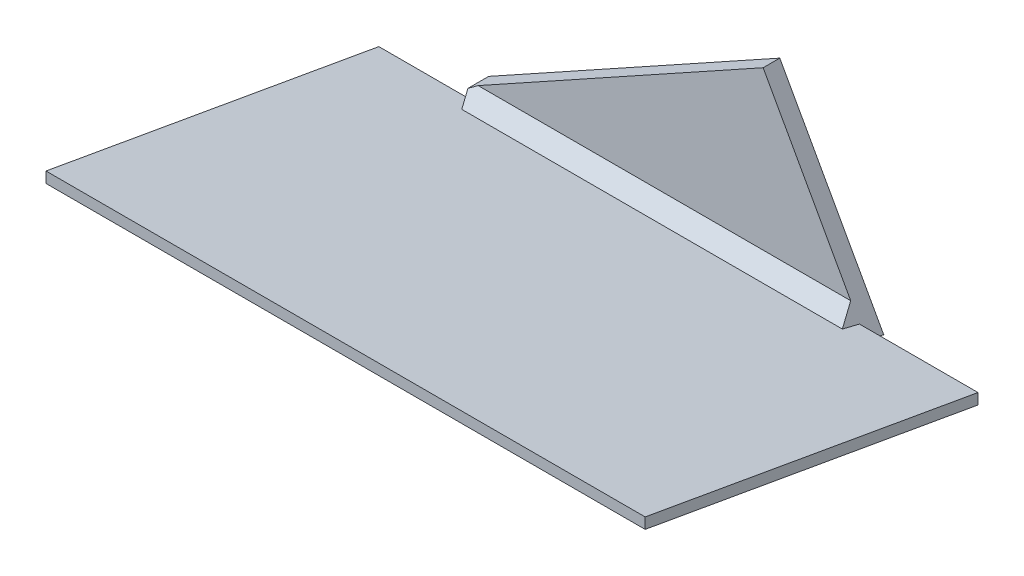
ISO-10303-21;
HEADER;
FILE_DESCRIPTION(('STEP AP214'),'2;1');
FILE_NAME('part.step','',(''),(''),'','','');
FILE_SCHEMA(('AUTOMOTIVE_DESIGN { 1 0 10303 214 1 1 1 1 }'));
ENDSEC;
DATA;
#1=APPLICATION_CONTEXT('core data for automotive mechanical design processes');
#2=APPLICATION_PROTOCOL_DEFINITION('international standard','automotive_design',2000,#1);
#3=PRODUCT_CONTEXT('',#1,'mechanical');
#4=PRODUCT('Part','Part','',(#3));
#5=PRODUCT_RELATED_PRODUCT_CATEGORY('part','',(#4));
#6=PRODUCT_DEFINITION_FORMATION('','',#4);
#7=PRODUCT_DEFINITION_CONTEXT('part definition',#1,'design');
#8=PRODUCT_DEFINITION('design','',#6,#7);
#9=PRODUCT_DEFINITION_SHAPE('','',#8);
#10=(LENGTH_UNIT() NAMED_UNIT(*) SI_UNIT(.MILLI.,.METRE.));
#11=(NAMED_UNIT(*) PLANE_ANGLE_UNIT() SI_UNIT($,.RADIAN.));
#12=(NAMED_UNIT(*) SI_UNIT($,.STERADIAN.) SOLID_ANGLE_UNIT());
#13=UNCERTAINTY_MEASURE_WITH_UNIT(LENGTH_MEASURE(1.E-05),#10,'distance_accuracy_value','');
#14=(GEOMETRIC_REPRESENTATION_CONTEXT(3) GLOBAL_UNCERTAINTY_ASSIGNED_CONTEXT((#13)) GLOBAL_UNIT_ASSIGNED_CONTEXT((#10,
#11,#12)) REPRESENTATION_CONTEXT('',''));
#15=CARTESIAN_POINT('',(0.,0.,0.));
#16=DIRECTION('',(0.,0.,1.));
#17=DIRECTION('',(1.,0.,0.));
#18=AXIS2_PLACEMENT_3D('',#15,#16,#17);
#19=CARTESIAN_POINT('',(-57.15,3.175,-31.75));
#20=DIRECTION('',(0.,0.,1.));
#21=DIRECTION('',(1.,0.,0.));
#22=AXIS2_PLACEMENT_3D('',#19,#20,#21);
#23=PLANE('',#22);
#24=DIRECTION('',(0.,-1.,0.));
#25=VECTOR('',#24,1.);
#26=CARTESIAN_POINT('',(57.15,3.175,-31.75));
#27=LINE('',#26,#25);
#28=CARTESIAN_POINT('',(57.15,3.175,-31.75));
#29=VERTEX_POINT('',#28);
#30=CARTESIAN_POINT('',(57.15,1.11165312464817,-31.75));
#31=VERTEX_POINT('',#30);
#32=EDGE_CURVE('E154',#29,#31,#27,.T.);
#33=ORIENTED_EDGE('',*,*,#32,.T.);
#34=DIRECTION('',(-1.,0.,0.));
#35=VECTOR('',#34,1.);
#36=CARTESIAN_POINT('',(-57.15,1.11165312464816,-31.75));
#37=LINE('',#36,#35);
#38=CARTESIAN_POINT('',(35.6852922659097,1.11165312464816,-31.75));
#39=VERTEX_POINT('',#38);
#40=EDGE_CURVE('E202',#31,#39,#37,.T.);
#41=ORIENTED_EDGE('',*,*,#40,.T.);
#42=DIRECTION('',(0.484809620246338,-0.874619707139395,0.));
#43=VECTOR('',#42,1.);
#44=CARTESIAN_POINT('',(16.1583186598094,36.3392460259776,-31.75));
#45=LINE('',#44,#43);
#46=CARTESIAN_POINT('',(34.5415604166154,3.17499999999999,-31.75));
#47=VERTEX_POINT('',#46);
#48=EDGE_CURVE('E165',#47,#39,#45,.T.);
#49=ORIENTED_EDGE('',*,*,#48,.F.);
#50=DIRECTION('',(-1.,0.,0.));
#51=VECTOR('',#50,1.);
#52=CARTESIAN_POINT('',(-57.15,3.175,-31.75));
#53=LINE('',#52,#51);
#54=EDGE_CURVE('E156',#29,#47,#53,.T.);
#55=ORIENTED_EDGE('',*,*,#54,.F.);
#56=EDGE_LOOP('',(#33,#41,#49,#55));
#57=FACE_BOUND('',#56,.T.);
#58=ADVANCED_FACE('F45',(#57),#23,.F.);
#59=CARTESIAN_POINT('',(57.15,3.175,-31.75));
#60=DIRECTION('',(-1.,0.,0.));
#61=DIRECTION('',(0.,0.,1.));
#62=AXIS2_PLACEMENT_3D('',#59,#60,#61);
#63=PLANE('',#62);
#64=DIRECTION('',(0.,-1.,0.));
#65=VECTOR('',#64,1.);
#66=CARTESIAN_POINT('',(57.15,3.175,31.75));
#67=LINE('',#66,#65);
#68=CARTESIAN_POINT('',(57.15,14.3717632749875,31.75));
#69=VERTEX_POINT('',#68);
#70=CARTESIAN_POINT('',(57.15,12.3084163996357,31.75));
#71=VERTEX_POINT('',#70);
#72=EDGE_CURVE('E152',#69,#71,#67,.T.);
#73=ORIENTED_EDGE('',*,*,#72,.T.);
#74=DIRECTION('',(0.,0.17364817766693,0.984807753012208));
#75=VECTOR('',#74,1.);
#76=CARTESIAN_POINT('',(57.15,0.551814960898789,-34.925));
#77=LINE('',#76,#75);
#78=EDGE_CURVE('E134',#31,#71,#77,.T.);
#79=ORIENTED_EDGE('',*,*,#78,.F.);
#80=ORIENTED_EDGE('',*,*,#32,.F.);
#81=DIRECTION('',(0.,-0.17364817766693,-0.984807753012208));
#82=VECTOR('',#81,1.);
#83=CARTESIAN_POINT('',(57.15,18.1760935927349,53.3254293668611));
#84=LINE('',#83,#82);
#85=EDGE_CURVE('E197',#69,#29,#84,.T.);
#86=ORIENTED_EDGE('',*,*,#85,.F.);
#87=EDGE_LOOP('',(#73,#79,#80,#86));
#88=FACE_BOUND('',#87,.T.);
#89=ADVANCED_FACE('F255',(#88),#63,.F.);
#90=DIRECTION('',(0.484809620246338,-0.874619707139395,0.));
#91=VECTOR('',#90,1.);
#92=CARTESIAN_POINT('',(-39.3800327435422,5.55383514033517,-31.75));
#93=LINE('',#92,#91);
#94=CARTESIAN_POINT('',(-38.0614228933405,3.175,-31.75));
#95=VERTEX_POINT('',#94);
#96=CARTESIAN_POINT('',(-36.9176910440462,1.11165312464817,-31.75));
#97=VERTEX_POINT('',#96);
#98=EDGE_CURVE('E162',#95,#97,#93,.T.);
#99=ORIENTED_EDGE('',*,*,#98,.T.);
#100=DIRECTION('',(-1.,0.,0.));
#101=VECTOR('',#100,1.);
#102=CARTESIAN_POINT('',(-57.15,1.11165312464816,-31.75));
#103=LINE('',#102,#101);
#104=CARTESIAN_POINT('',(-57.15,1.11165312464816,-31.75));
#105=VERTEX_POINT('',#104);
#106=EDGE_CURVE('E234',#97,#105,#103,.T.);
#107=ORIENTED_EDGE('',*,*,#106,.T.);
#108=DIRECTION('',(0.,-1.,0.));
#109=VECTOR('',#108,1.);
#110=CARTESIAN_POINT('',(-57.15,3.175,-31.75));
#111=LINE('',#110,#109);
#112=CARTESIAN_POINT('',(-57.15,3.175,-31.75));
#113=VERTEX_POINT('',#112);
#114=EDGE_CURVE('E146',#113,#105,#111,.T.);
#115=ORIENTED_EDGE('',*,*,#114,.F.);
#116=EDGE_CURVE('E200',#95,#113,#53,.T.);
#117=ORIENTED_EDGE('',*,*,#116,.F.);
#118=EDGE_LOOP('',(#99,#107,#115,#117));
#119=FACE_BOUND('',#118,.T.);
#120=ADVANCED_FACE('F228',(#119),#23,.F.);
#121=CARTESIAN_POINT('',(-57.15,3.175,-31.75));
#122=DIRECTION('',(1.,0.,0.));
#123=DIRECTION('',(0.,0.,-1.));
#124=AXIS2_PLACEMENT_3D('',#121,#122,#123);
#125=PLANE('',#124);
#126=ORIENTED_EDGE('',*,*,#114,.T.);
#127=DIRECTION('',(0.,0.17364817766693,0.984807753012208));
#128=VECTOR('',#127,1.);
#129=CARTESIAN_POINT('',(-57.15,0.551814960898789,-34.925));
#130=LINE('',#129,#128);
#131=CARTESIAN_POINT('',(-57.15,12.3084163996357,31.75));
#132=VERTEX_POINT('',#131);
#133=EDGE_CURVE('E131',#105,#132,#130,.T.);
#134=ORIENTED_EDGE('',*,*,#133,.T.);
#135=DIRECTION('',(0.,-1.,0.));
#136=VECTOR('',#135,1.);
#137=CARTESIAN_POINT('',(-57.15,3.175,31.75));
#138=LINE('',#137,#136);
#139=CARTESIAN_POINT('',(-57.15,14.3717632749875,31.75));
#140=VERTEX_POINT('',#139);
#141=EDGE_CURVE('E144',#140,#132,#138,.T.);
#142=ORIENTED_EDGE('',*,*,#141,.F.);
#143=DIRECTION('',(0.,0.17364817766693,0.984807753012208));
#144=VECTOR('',#143,1.);
#145=CARTESIAN_POINT('',(-57.15,7.31695404214494,-8.2598113430915));
#146=LINE('',#145,#144);
#147=EDGE_CURVE('E208',#113,#140,#146,.T.);
#148=ORIENTED_EDGE('',*,*,#147,.F.);
#149=EDGE_LOOP('',(#126,#134,#142,#148));
#150=FACE_BOUND('',#149,.T.);
#151=ADVANCED_FACE('F142',(#150),#125,.F.);
#152=CARTESIAN_POINT('',(-57.15,3.175,31.75));
#153=DIRECTION('',(0.,0.,-1.));
#154=DIRECTION('',(-1.,0.,0.));
#155=AXIS2_PLACEMENT_3D('',#152,#153,#154);
#156=PLANE('',#155);
#157=ORIENTED_EDGE('',*,*,#141,.T.);
#158=DIRECTION('',(1.,0.,0.));
#159=VECTOR('',#158,1.);
#160=CARTESIAN_POINT('',(-57.15,12.3084163996357,31.75));
#161=LINE('',#160,#159);
#162=EDGE_CURVE('E128',#132,#71,#161,.T.);
#163=ORIENTED_EDGE('',*,*,#162,.T.);
#164=ORIENTED_EDGE('',*,*,#72,.F.);
#165=DIRECTION('',(1.,0.,0.));
#166=VECTOR('',#165,1.);
#167=CARTESIAN_POINT('',(-57.15,14.3717632749875,31.75));
#168=LINE('',#167,#166);
#169=EDGE_CURVE('E150',#140,#69,#168,.T.);
#170=ORIENTED_EDGE('',*,*,#169,.F.);
#171=EDGE_LOOP('',(#157,#163,#164,#170));
#172=FACE_BOUND('',#171,.T.);
#173=ADVANCED_FACE('F148',(#172),#156,.F.);
#174=CARTESIAN_POINT('',(16.1583186598094,36.3392460259776,-34.925));
#175=DIRECTION('',(-0.874619707139395,-0.484809620246338,0.));
#176=DIRECTION('',(0.484809620246338,-0.874619707139396,0.));
#177=AXIS2_PLACEMENT_3D('',#174,#175,#176);
#178=PLANE('',#177);
#179=ORIENTED_EDGE('',*,*,#48,.T.);
#180=DIRECTION('',(0.095811932243175,-0.172849301291517,-0.980277099948205));
#181=VECTOR('',#180,1.);
#182=CARTESIAN_POINT('',(35.2208341420677,1.94955776038287,-26.9980066727843));
#183=LINE('',#182,#181);
#184=CARTESIAN_POINT('',(35.9956156274247,0.551814960898789,-34.925));
#185=VERTEX_POINT('',#184);
#186=EDGE_CURVE('E236',#39,#185,#183,.T.);
#187=ORIENTED_EDGE('',*,*,#186,.T.);
#188=DIRECTION('',(0.484809620246338,-0.874619707139395,0.));
#189=VECTOR('',#188,1.);
#190=CARTESIAN_POINT('',(16.1583186598094,36.3392460259776,-34.925));
#191=LINE('',#190,#189);
#192=CARTESIAN_POINT('',(16.1583186598094,36.3392460259776,-34.925));
#193=VERTEX_POINT('',#192);
#194=EDGE_CURVE('E187',#193,#185,#191,.T.);
#195=ORIENTED_EDGE('',*,*,#194,.F.);
#196=DIRECTION('',(0.,0.,1.));
#197=VECTOR('',#196,1.);
#198=CARTESIAN_POINT('',(16.1583186598094,36.3392460259776,-34.925));
#199=LINE('',#198,#197);
#200=CARTESIAN_POINT('',(16.1583186598094,36.3392460259776,-31.75));
#201=VERTEX_POINT('',#200);
#202=EDGE_CURVE('E219',#193,#201,#199,.T.);
#203=ORIENTED_EDGE('',*,*,#202,.T.);
#204=CARTESIAN_POINT('',(32.8636369157855,6.20205412518928,-31.75));
#205=VERTEX_POINT('',#204);
#206=EDGE_CURVE('E186',#201,#205,#45,.T.);
#207=ORIENTED_EDGE('',*,*,#206,.T.);
#208=DIRECTION('',(0.33563465190871,-0.605500940367213,0.721607921001799));
#209=VECTOR('',#208,1.);
#210=CARTESIAN_POINT('',(24.0881041527463,22.033534307661,-50.6172233835448));
#211=LINE('',#210,#209);
#212=CARTESIAN_POINT('',(34.2501920584318,3.70064243253828,-28.768933628726));
#213=VERTEX_POINT('',#212);
#214=EDGE_CURVE('E13',#205,#213,#211,.T.);
#215=ORIENTED_EDGE('',*,*,#214,.T.);
#216=DIRECTION('',(-0.095811932243175,0.172849301291517,0.980277099948205));
#217=VECTOR('',#216,1.);
#218=CARTESIAN_POINT('',(31.2950214739437,9.03191129192816,1.46619452902591));
#219=LINE('',#218,#217);
#220=EDGE_CURVE('E60',#47,#213,#219,.T.);
#221=ORIENTED_EDGE('',*,*,#220,.F.);
#222=EDGE_LOOP('',(#179,#187,#195,#203,#207,#215,#221));
#223=FACE_BOUND('',#222,.T.);
#224=ADVANCED_FACE('F191',(#223),#178,.F.);
#225=CARTESIAN_POINT('',(-39.3800327435422,5.55383514033517,-34.925));
#226=DIRECTION('',(-0.874619707139395,-0.484809620246338,0.));
#227=DIRECTION('',(0.484809620246338,-0.874619707139395,0.));
#228=AXIS2_PLACEMENT_3D('',#225,#226,#227);
#229=PLANE('',#228);
#230=DIRECTION('',(0.0958119322431751,-0.172849301291517,-0.980277099948205));
#231=VECTOR('',#230,1.);
#232=CARTESIAN_POINT('',(-36.7156591275741,0.747177899243464,-33.8170417195388));
#233=LINE('',#232,#231);
#234=CARTESIAN_POINT('',(-36.6073676825312,0.551814960898788,-34.925));
#235=VERTEX_POINT('',#234);
#236=EDGE_CURVE('E138',#97,#235,#233,.T.);
#237=ORIENTED_EDGE('',*,*,#236,.F.);
#238=ORIENTED_EDGE('',*,*,#98,.F.);
#239=DIRECTION('',(0.0958119322431751,-0.172849301291517,-0.980277099948205));
#240=VECTOR('',#239,1.);
#241=CARTESIAN_POINT('',(-37.814720462408,2.72993703325626,-34.2740775118789));
#242=LINE('',#241,#240);
#243=CARTESIAN_POINT('',(-38.3527912515241,3.70064243253828,-28.768933628726));
#244=VERTEX_POINT('',#243);
#245=EDGE_CURVE('E170',#244,#95,#242,.T.);
#246=ORIENTED_EDGE('',*,*,#245,.F.);
#247=DIRECTION('',(-0.335634651908711,0.605500940367213,-0.721607921001799));
#248=VECTOR('',#247,1.);
#249=CARTESIAN_POINT('',(-34.0323255551124,-4.0936840088004,-19.4800170904086));
#250=LINE('',#249,#248);
#251=CARTESIAN_POINT('',(-39.3800327435422,5.55383514033517,-30.9774826960123));
#252=VERTEX_POINT('',#251);
#253=EDGE_CURVE('E174',#244,#252,#250,.T.);
#254=ORIENTED_EDGE('',*,*,#253,.T.);
#255=DIRECTION('',(0.,0.,1.));
#256=VECTOR('',#255,1.);
#257=CARTESIAN_POINT('',(-39.3800327435422,5.55383514033517,-34.925));
#258=LINE('',#257,#256);
#259=CARTESIAN_POINT('',(-39.3800327435422,5.55383514033517,-34.925));
#260=VERTEX_POINT('',#259);
#261=EDGE_CURVE('E68',#260,#252,#258,.T.);
#262=ORIENTED_EDGE('',*,*,#261,.F.);
#263=DIRECTION('',(0.484809620246338,-0.874619707139395,0.));
#264=VECTOR('',#263,1.);
#265=CARTESIAN_POINT('',(-39.3800327435422,5.55383514033517,-34.925));
#266=LINE('',#265,#264);
#267=EDGE_CURVE('E216',#260,#235,#266,.T.);
#268=ORIENTED_EDGE('',*,*,#267,.T.);
#269=EDGE_LOOP('',(#237,#238,#246,#254,#262,#268));
#270=FACE_BOUND('',#269,.T.);
#271=ADVANCED_FACE('F231',(#270),#229,.T.);
#272=CARTESIAN_POINT('',(16.1583186598094,36.3392460259776,-34.925));
#273=DIRECTION('',(-0.484809620246338,0.874619707139396,0.));
#274=DIRECTION('',(-0.874619707139396,-0.484809620246338,0.));
#275=AXIS2_PLACEMENT_3D('',#272,#273,#274);
#276=PLANE('',#275);
#277=DIRECTION('',(-0.874619707139395,-0.484809620246338,0.));
#278=VECTOR('',#277,1.);
#279=CARTESIAN_POINT('',(16.1583186598094,36.3392460259776,-31.75));
#280=LINE('',#279,#278);
#281=CARTESIAN_POINT('',(-38.2106147389918,6.20205412518929,-31.75));
#282=VERTEX_POINT('',#281);
#283=EDGE_CURVE('E179',#201,#282,#280,.T.);
#284=ORIENTED_EDGE('',*,*,#283,.F.);
#285=ORIENTED_EDGE('',*,*,#202,.F.);
#286=DIRECTION('',(-0.874619707139395,-0.484809620246338,0.));
#287=VECTOR('',#286,1.);
#288=CARTESIAN_POINT('',(16.1583186598094,36.3392460259776,-34.925));
#289=LINE('',#288,#287);
#290=EDGE_CURVE('E218',#193,#260,#289,.T.);
#291=ORIENTED_EDGE('',*,*,#290,.T.);
#292=ORIENTED_EDGE('',*,*,#261,.T.);
#293=DIRECTION('',(0.757304025090444,0.419780475809249,-0.50027489014658));
#294=VECTOR('',#293,1.);
#295=CARTESIAN_POINT('',(-18.221078280206,17.2824351186394,-44.9550838562568));
#296=LINE('',#295,#294);
#297=EDGE_CURVE('E54',#252,#282,#296,.T.);
#298=ORIENTED_EDGE('',*,*,#297,.T.);
#299=EDGE_LOOP('',(#284,#285,#291,#292,#298));
#300=FACE_BOUND('',#299,.T.);
#301=ADVANCED_FACE('F178',(#300),#276,.T.);
#302=CARTESIAN_POINT('',(0.,0.,-34.925));
#303=DIRECTION('',(0.,0.,-1.));
#304=DIRECTION('',(-1.,0.,0.));
#305=AXIS2_PLACEMENT_3D('',#302,#303,#304);
#306=PLANE('',#305);
#307=DIRECTION('',(1.,0.,0.));
#308=VECTOR('',#307,1.);
#309=CARTESIAN_POINT('',(0.,0.551814960898789,-34.925));
#310=LINE('',#309,#308);
#311=EDGE_CURVE('E163',#235,#185,#310,.T.);
#312=ORIENTED_EDGE('',*,*,#311,.F.);
#313=ORIENTED_EDGE('',*,*,#267,.F.);
#314=ORIENTED_EDGE('',*,*,#290,.F.);
#315=ORIENTED_EDGE('',*,*,#194,.T.);
#316=EDGE_LOOP('',(#312,#313,#314,#315));
#317=FACE_BOUND('',#316,.T.);
#318=ADVANCED_FACE('F242',(#317),#306,.T.);
#319=CARTESIAN_POINT('',(0.,0.,-31.75));
#320=DIRECTION('',(0.,0.,-1.));
#321=DIRECTION('',(-1.,0.,0.));
#322=AXIS2_PLACEMENT_3D('',#319,#320,#321);
#323=PLANE('',#322);
#324=ORIENTED_EDGE('',*,*,#283,.T.);
#325=DIRECTION('',(1.,0.,0.));
#326=VECTOR('',#325,1.);
#327=CARTESIAN_POINT('',(0.,6.20205412518929,-31.75));
#328=LINE('',#327,#326);
#329=EDGE_CURVE('E172',#282,#205,#328,.T.);
#330=ORIENTED_EDGE('',*,*,#329,.T.);
#331=ORIENTED_EDGE('',*,*,#206,.F.);
#332=EDGE_LOOP('',(#324,#330,#331));
#333=FACE_BOUND('',#332,.T.);
#334=ADVANCED_FACE('F184',(#333),#323,.F.);
#335=CARTESIAN_POINT('',(0.,8.50883181079261,-1.5003366225532));
#336=DIRECTION('',(0.,0.984807753012208,-0.17364817766693));
#337=DIRECTION('',(0.,0.17364817766693,0.984807753012208));
#338=AXIS2_PLACEMENT_3D('',#335,#336,#337);
#339=PLANE('',#338);
#340=DIRECTION('',(-1.,0.,0.));
#341=VECTOR('',#340,1.);
#342=CARTESIAN_POINT('',(0.,3.70064243253828,-28.768933628726));
#343=LINE('',#342,#341);
#344=EDGE_CURVE('E167',#213,#244,#343,.T.);
#345=ORIENTED_EDGE('',*,*,#344,.T.);
#346=ORIENTED_EDGE('',*,*,#245,.T.);
#347=ORIENTED_EDGE('',*,*,#116,.T.);
#348=ORIENTED_EDGE('',*,*,#147,.T.);
#349=ORIENTED_EDGE('',*,*,#169,.T.);
#350=ORIENTED_EDGE('',*,*,#85,.T.);
#351=ORIENTED_EDGE('',*,*,#54,.T.);
#352=ORIENTED_EDGE('',*,*,#220,.T.);
#353=EDGE_LOOP('',(#345,#346,#347,#348,#349,#350,#351,#352));
#354=FACE_BOUND('',#353,.T.);
#355=ADVANCED_FACE('F193',(#354),#339,.T.);
#356=CARTESIAN_POINT('',(-57.15,0.551814960898789,-34.925));
#357=DIRECTION('',(0.,0.984807753012208,-0.17364817766693));
#358=DIRECTION('',(0.,0.17364817766693,0.984807753012208));
#359=AXIS2_PLACEMENT_3D('',#356,#357,#358);
#360=PLANE('',#359);
#361=ORIENTED_EDGE('',*,*,#78,.T.);
#362=ORIENTED_EDGE('',*,*,#162,.F.);
#363=ORIENTED_EDGE('',*,*,#133,.F.);
#364=ORIENTED_EDGE('',*,*,#106,.F.);
#365=ORIENTED_EDGE('',*,*,#236,.T.);
#366=ORIENTED_EDGE('',*,*,#311,.T.);
#367=ORIENTED_EDGE('',*,*,#186,.F.);
#368=ORIENTED_EDGE('',*,*,#40,.F.);
#369=EDGE_LOOP('',(#361,#362,#363,#364,#365,#366,#367,#368));
#370=FACE_BOUND('',#369,.T.);
#371=ADVANCED_FACE('F130',(#370),#360,.F.);
#372=CARTESIAN_POINT('',(0.,3.70064243253828,-28.768933628726));
#373=DIRECTION('',(0.,-0.766044443118978,-0.642787609686539));
#374=DIRECTION('',(-1.,0.,0.));
#375=AXIS2_PLACEMENT_3D('',#372,#373,#374);
#376=PLANE('',#375);
#377=ORIENTED_EDGE('',*,*,#214,.F.);
#378=ORIENTED_EDGE('',*,*,#329,.F.);
#379=ORIENTED_EDGE('',*,*,#297,.F.);
#380=ORIENTED_EDGE('',*,*,#253,.F.);
#381=ORIENTED_EDGE('',*,*,#344,.F.);
#382=EDGE_LOOP('',(#377,#378,#379,#380,#381));
#383=FACE_BOUND('',#382,.T.);
#384=ADVANCED_FACE('F48',(#383),#376,.F.);
#385=CLOSED_SHELL('',(#58,#89,#120,#151,#173,#224,#271,#301,#318,#334,#355,#371,#384));
#386=MANIFOLD_SOLID_BREP('B2',#385);
#387=ADVANCED_BREP_SHAPE_REPRESENTATION('',(#18,#386),#14);
#388=SHAPE_DEFINITION_REPRESENTATION(#9,#387);
ENDSEC;
END-ISO-10303-21;
